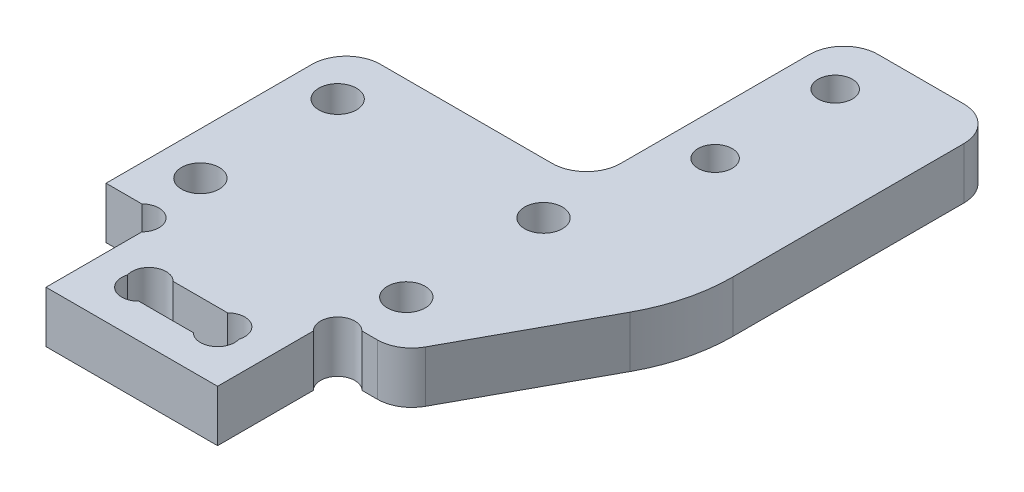
ISO-10303-21;
HEADER;
FILE_DESCRIPTION(('STEP AP214'),'2;1');
FILE_NAME('part.step','',(''),(''),'','','');
FILE_SCHEMA(('AUTOMOTIVE_DESIGN { 1 0 10303 214 1 1 1 1 }'));
ENDSEC;
DATA;
#1=APPLICATION_CONTEXT('core data for automotive mechanical design processes');
#2=APPLICATION_PROTOCOL_DEFINITION('international standard','automotive_design',2000,#1);
#3=PRODUCT_CONTEXT('',#1,'mechanical');
#4=PRODUCT('Part','Part','',(#3));
#5=PRODUCT_RELATED_PRODUCT_CATEGORY('part','',(#4));
#6=PRODUCT_DEFINITION_FORMATION('','',#4);
#7=PRODUCT_DEFINITION_CONTEXT('part definition',#1,'design');
#8=PRODUCT_DEFINITION('design','',#6,#7);
#9=PRODUCT_DEFINITION_SHAPE('','',#8);
#10=(LENGTH_UNIT() NAMED_UNIT(*) SI_UNIT(.MILLI.,.METRE.));
#11=(NAMED_UNIT(*) PLANE_ANGLE_UNIT() SI_UNIT($,.RADIAN.));
#12=(NAMED_UNIT(*) SI_UNIT($,.STERADIAN.) SOLID_ANGLE_UNIT());
#13=UNCERTAINTY_MEASURE_WITH_UNIT(LENGTH_MEASURE(1.E-05),#10,'distance_accuracy_value','');
#14=(GEOMETRIC_REPRESENTATION_CONTEXT(3) GLOBAL_UNCERTAINTY_ASSIGNED_CONTEXT((#13)) GLOBAL_UNIT_ASSIGNED_CONTEXT((#10,
#11,#12)) REPRESENTATION_CONTEXT('',''));
#15=CARTESIAN_POINT('',(0.,0.,0.));
#16=DIRECTION('',(0.,0.,1.));
#17=DIRECTION('',(1.,0.,0.));
#18=AXIS2_PLACEMENT_3D('',#15,#16,#17);
#19=CARTESIAN_POINT('',(-8.5,3.,7.));
#20=DIRECTION('',(0.,0.,-1.));
#21=DIRECTION('',(-1.,0.,0.));
#22=AXIS2_PLACEMENT_3D('',#19,#20,#21);
#23=PLANE('',#22);
#24=DIRECTION('',(1.,0.,0.));
#25=VECTOR('',#24,1.);
#26=CARTESIAN_POINT('',(-8.5,0.,7.));
#27=LINE('',#26,#25);
#28=CARTESIAN_POINT('',(6.4142135623731,0.,7.));
#29=VERTEX_POINT('',#28);
#30=CARTESIAN_POINT('',(7.3127338025197,0.,7.));
#31=VERTEX_POINT('',#30);
#32=EDGE_CURVE('E362',#29,#31,#27,.T.);
#33=ORIENTED_EDGE('',*,*,#32,.T.);
#34=DIRECTION('',(0.,-1.,0.));
#35=VECTOR('',#34,1.);
#36=CARTESIAN_POINT('',(7.3127338025197,3.,7.));
#37=LINE('',#36,#35);
#38=CARTESIAN_POINT('',(7.3127338025197,3.,7.));
#39=VERTEX_POINT('',#38);
#40=EDGE_CURVE('E421',#31,#39,#37,.F.);
#41=ORIENTED_EDGE('',*,*,#40,.T.);
#42=DIRECTION('',(1.,0.,0.));
#43=VECTOR('',#42,1.);
#44=CARTESIAN_POINT('',(-8.5,3.,7.));
#45=LINE('',#44,#43);
#46=CARTESIAN_POINT('',(6.4142135623731,3.,7.));
#47=VERTEX_POINT('',#46);
#48=EDGE_CURVE('E353',#47,#39,#45,.T.);
#49=ORIENTED_EDGE('',*,*,#48,.F.);
#50=DIRECTION('',(0.,1.,0.));
#51=VECTOR('',#50,1.);
#52=CARTESIAN_POINT('',(6.4142135623731,0.,7.));
#53=LINE('',#52,#51);
#54=EDGE_CURVE('E254',#47,#29,#53,.F.);
#55=ORIENTED_EDGE('',*,*,#54,.T.);
#56=EDGE_LOOP('',(#33,#41,#49,#55));
#57=FACE_BOUND('',#56,.T.);
#58=ADVANCED_FACE('F38',(#57),#23,.F.);
#59=CARTESIAN_POINT('',(-8.5,3.,-7.));
#60=DIRECTION('',(0.,0.,1.));
#61=DIRECTION('',(1.,0.,0.));
#62=AXIS2_PLACEMENT_3D('',#59,#60,#61);
#63=PLANE('',#62);
#64=DIRECTION('',(-1.,0.,0.));
#65=VECTOR('',#64,1.);
#66=CARTESIAN_POINT('',(-8.5,3.,-7.));
#67=LINE('',#66,#65);
#68=CARTESIAN_POINT('',(3.5,3.,-7.));
#69=VERTEX_POINT('',#68);
#70=CARTESIAN_POINT('',(-6.5,3.,-7.));
#71=VERTEX_POINT('',#70);
#72=EDGE_CURVE('E347',#69,#71,#67,.T.);
#73=ORIENTED_EDGE('',*,*,#72,.F.);
#74=DIRECTION('',(0.,1.,0.));
#75=VECTOR('',#74,1.);
#76=CARTESIAN_POINT('',(3.5,0.,-7.));
#77=LINE('',#76,#75);
#78=CARTESIAN_POINT('',(3.5,0.,-7.));
#79=VERTEX_POINT('',#78);
#80=EDGE_CURVE('E413',#69,#79,#77,.F.);
#81=ORIENTED_EDGE('',*,*,#80,.T.);
#82=DIRECTION('',(-1.,0.,0.));
#83=VECTOR('',#82,1.);
#84=CARTESIAN_POINT('',(-8.5,0.,-7.));
#85=LINE('',#84,#83);
#86=CARTESIAN_POINT('',(-6.5,0.,-7.));
#87=VERTEX_POINT('',#86);
#88=EDGE_CURVE('E344',#79,#87,#85,.T.);
#89=ORIENTED_EDGE('',*,*,#88,.T.);
#90=DIRECTION('',(0.,-1.,0.));
#91=VECTOR('',#90,1.);
#92=CARTESIAN_POINT('',(-6.5,3.,-7.));
#93=LINE('',#92,#91);
#94=EDGE_CURVE('E411',#87,#71,#93,.F.);
#95=ORIENTED_EDGE('',*,*,#94,.T.);
#96=EDGE_LOOP('',(#73,#81,#89,#95));
#97=FACE_BOUND('',#96,.T.);
#98=ADVANCED_FACE('F455',(#97),#63,.F.);
#99=CARTESIAN_POINT('',(0.,3.,0.));
#100=DIRECTION('',(0.,-1.,0.));
#101=DIRECTION('',(0.,0.,-1.));
#102=AXIS2_PLACEMENT_3D('',#99,#100,#101);
#103=PLANE('',#102);
#104=CARTESIAN_POINT('',(8.,3.,-19.));
#105=DIRECTION('',(0.,1.,0.));
#106=DIRECTION('',(0.,0.,1.));
#107=AXIS2_PLACEMENT_3D('',#104,#105,#106);
#108=CIRCLE('',#107,1.);
#109=CARTESIAN_POINT('',(8.,3.,-18.));
#110=VERTEX_POINT('',#109);
#111=EDGE_CURVE('E291',#110,#110,#108,.T.);
#112=ORIENTED_EDGE('',*,*,#111,.F.);
#113=EDGE_LOOP('',(#112));
#114=FACE_BOUND('',#113,.T.);
#115=CARTESIAN_POINT('',(8.,3.,-12.));
#116=DIRECTION('',(0.,1.,0.));
#117=DIRECTION('',(0.,0.,1.));
#118=AXIS2_PLACEMENT_3D('',#115,#116,#117);
#119=CIRCLE('',#118,1.);
#120=CARTESIAN_POINT('',(8.,3.,-11.));
#121=VERTEX_POINT('',#120);
#122=EDGE_CURVE('E282',#121,#121,#119,.T.);
#123=ORIENTED_EDGE('',*,*,#122,.F.);
#124=EDGE_LOOP('',(#123));
#125=FACE_BOUND('',#124,.T.);
#126=DIRECTION('',(0.,0.,-1.));
#127=VECTOR('',#126,1.);
#128=CARTESIAN_POINT('',(14.5,3.,0.));
#129=LINE('',#128,#127);
#130=CARTESIAN_POINT('',(14.5,3.,-6.54994014356944));
#131=VERTEX_POINT('',#130);
#132=CARTESIAN_POINT('',(14.5,3.,-20.));
#133=VERTEX_POINT('',#132);
#134=EDGE_CURVE('E307',#131,#133,#129,.T.);
#135=ORIENTED_EDGE('',*,*,#134,.T.);
#136=CARTESIAN_POINT('',(12.5,3.,-20.));
#137=DIRECTION('',(0.,-1.,0.));
#138=DIRECTION('',(0.,0.,-1.));
#139=AXIS2_PLACEMENT_3D('',#136,#137,#138);
#140=CIRCLE('',#139,2.);
#141=CARTESIAN_POINT('',(12.5,3.,-22.));
#142=VERTEX_POINT('',#141);
#143=EDGE_CURVE('E391',#133,#142,#140,.F.);
#144=ORIENTED_EDGE('',*,*,#143,.T.);
#145=DIRECTION('',(1.,0.,0.));
#146=VECTOR('',#145,1.);
#147=CARTESIAN_POINT('',(0.,3.,-22.));
#148=LINE('',#147,#146);
#149=CARTESIAN_POINT('',(7.5,3.,-22.));
#150=VERTEX_POINT('',#149);
#151=EDGE_CURVE('E303',#150,#142,#148,.T.);
#152=ORIENTED_EDGE('',*,*,#151,.F.);
#153=CARTESIAN_POINT('',(7.5,3.,-20.));
#154=DIRECTION('',(0.,-1.,0.));
#155=DIRECTION('',(0.,0.,-1.));
#156=AXIS2_PLACEMENT_3D('',#153,#154,#155);
#157=CIRCLE('',#156,2.);
#158=CARTESIAN_POINT('',(5.5,3.,-20.));
#159=VERTEX_POINT('',#158);
#160=EDGE_CURVE('E385',#150,#159,#157,.F.);
#161=ORIENTED_EDGE('',*,*,#160,.T.);
#162=DIRECTION('',(0.,0.,-1.));
#163=VECTOR('',#162,1.);
#164=CARTESIAN_POINT('',(5.5,3.,0.));
#165=LINE('',#164,#163);
#166=CARTESIAN_POINT('',(5.5,3.,-9.));
#167=VERTEX_POINT('',#166);
#168=EDGE_CURVE('E299',#167,#159,#165,.T.);
#169=ORIENTED_EDGE('',*,*,#168,.F.);
#170=CARTESIAN_POINT('',(3.5,3.,-9.));
#171=DIRECTION('',(0.,-1.,0.));
#172=DIRECTION('',(0.,0.,-1.));
#173=AXIS2_PLACEMENT_3D('',#170,#171,#172);
#174=CIRCLE('',#173,2.);
#175=EDGE_CURVE('E423',#167,#69,#174,.T.);
#176=ORIENTED_EDGE('',*,*,#175,.T.);
#177=ORIENTED_EDGE('',*,*,#72,.T.);
#178=CARTESIAN_POINT('',(-6.5,3.,-5.));
#179=DIRECTION('',(0.,-1.,0.));
#180=DIRECTION('',(0.,0.,-1.));
#181=AXIS2_PLACEMENT_3D('',#178,#179,#180);
#182=CIRCLE('',#181,2.);
#183=CARTESIAN_POINT('',(-8.5,3.,-5.));
#184=VERTEX_POINT('',#183);
#185=EDGE_CURVE('E389',#71,#184,#182,.F.);
#186=ORIENTED_EDGE('',*,*,#185,.T.);
#187=DIRECTION('',(0.,0.,1.));
#188=VECTOR('',#187,1.);
#189=CARTESIAN_POINT('',(-8.5,3.,7.));
#190=LINE('',#189,#188);
#191=CARTESIAN_POINT('',(-8.5,3.,7.));
#192=VERTEX_POINT('',#191);
#193=EDGE_CURVE('E350',#184,#192,#190,.T.);
#194=ORIENTED_EDGE('',*,*,#193,.T.);
#195=CARTESIAN_POINT('',(-6.4142135623731,3.,7.));
#196=VERTEX_POINT('',#195);
#197=EDGE_CURVE('E354',#192,#196,#45,.T.);
#198=ORIENTED_EDGE('',*,*,#197,.T.);
#199=CARTESIAN_POINT('',(-5.70710678118656,3.,7.70710678118655));
#200=DIRECTION('',(0.,1.,0.));
#201=DIRECTION('',(0.,0.,-1.));
#202=AXIS2_PLACEMENT_3D('',#199,#200,#201);
#203=CIRCLE('',#202,0.999999999999999);
#204=CARTESIAN_POINT('',(-5.,3.,8.41421356237309));
#205=VERTEX_POINT('',#204);
#206=EDGE_CURVE('E228',#205,#196,#203,.T.);
#207=ORIENTED_EDGE('',*,*,#206,.F.);
#208=DIRECTION('',(0.,0.,1.));
#209=VECTOR('',#208,1.);
#210=CARTESIAN_POINT('',(-5.,3.,0.));
#211=LINE('',#210,#209);
#212=CARTESIAN_POINT('',(-5.,3.,14.));
#213=VERTEX_POINT('',#212);
#214=EDGE_CURVE('E262',#205,#213,#211,.T.);
#215=ORIENTED_EDGE('',*,*,#214,.T.);
#216=DIRECTION('',(1.,0.,0.));
#217=VECTOR('',#216,1.);
#218=CARTESIAN_POINT('',(0.,3.,14.));
#219=LINE('',#218,#217);
#220=CARTESIAN_POINT('',(5.,3.,14.));
#221=VERTEX_POINT('',#220);
#222=EDGE_CURVE('E258',#213,#221,#219,.T.);
#223=ORIENTED_EDGE('',*,*,#222,.T.);
#224=DIRECTION('',(0.,0.,1.));
#225=VECTOR('',#224,1.);
#226=CARTESIAN_POINT('',(5.,3.,0.));
#227=LINE('',#226,#225);
#228=CARTESIAN_POINT('',(5.,3.,8.41421356237309));
#229=VERTEX_POINT('',#228);
#230=EDGE_CURVE('E257',#229,#221,#227,.T.);
#231=ORIENTED_EDGE('',*,*,#230,.F.);
#232=CARTESIAN_POINT('',(5.70710678118655,3.,7.70710678118654));
#233=DIRECTION('',(0.,1.,0.));
#234=DIRECTION('',(0.,0.,1.));
#235=AXIS2_PLACEMENT_3D('',#232,#233,#234);
#236=CIRCLE('',#235,1.);
#237=EDGE_CURVE('E246',#47,#229,#236,.T.);
#238=ORIENTED_EDGE('',*,*,#237,.F.);
#239=ORIENTED_EDGE('',*,*,#48,.T.);
#240=CARTESIAN_POINT('',(7.3127338025197,3.,5.));
#241=DIRECTION('',(0.,-1.,0.));
#242=DIRECTION('',(0.,0.,-1.));
#243=AXIS2_PLACEMENT_3D('',#240,#241,#242);
#244=CIRCLE('',#243,2.);
#245=CARTESIAN_POINT('',(9.06852494834847,3.,5.95770426136115));
#246=VERTEX_POINT('',#245);
#247=EDGE_CURVE('E387',#39,#246,#244,.F.);
#248=ORIENTED_EDGE('',*,*,#247,.T.);
#249=DIRECTION('',(-0.478852130680573,0.,0.877895572914384));
#250=VECTOR('',#249,1.);
#251=CARTESIAN_POINT('',(9.49363057324841,3.,5.17834394904459));
#252=LINE('',#251,#250);
#253=CARTESIAN_POINT('',(13.2789557291438,3.,-1.76141883676371));
#254=VERTEX_POINT('',#253);
#255=EDGE_CURVE('E302',#254,#246,#252,.T.);
#256=ORIENTED_EDGE('',*,*,#255,.F.);
#257=CARTESIAN_POINT('',(4.5,3.,-6.54994014356944));
#258=DIRECTION('',(0.,-1.,0.));
#259=DIRECTION('',(0.,0.,-1.));
#260=AXIS2_PLACEMENT_3D('',#257,#258,#259);
#261=CIRCLE('',#260,10.);
#262=EDGE_CURVE('E376',#254,#131,#261,.F.);
#263=ORIENTED_EDGE('',*,*,#262,.T.);
#264=EDGE_LOOP('',(#135,#144,#152,#161,#169,#176,#177,#186,#194,#198,#207,#215,#223,#231,#238,
#239,#248,#256,#263));
#265=FACE_BOUND('',#264,.T.);
#266=CARTESIAN_POINT('',(-6.,3.,-4.));
#267=DIRECTION('',(0.,1.,0.));
#268=DIRECTION('',(0.,0.,1.));
#269=AXIS2_PLACEMENT_3D('',#266,#267,#268);
#270=CIRCLE('',#269,1.1);
#271=CARTESIAN_POINT('',(-6.,3.,-2.9));
#272=VERTEX_POINT('',#271);
#273=EDGE_CURVE('E341',#272,#272,#270,.T.);
#274=ORIENTED_EDGE('',*,*,#273,.F.);
#275=EDGE_LOOP('',(#274));
#276=FACE_BOUND('',#275,.T.);
#277=CARTESIAN_POINT('',(6.,3.,-4.));
#278=DIRECTION('',(0.,1.,0.));
#279=DIRECTION('',(0.,0.,-1.));
#280=AXIS2_PLACEMENT_3D('',#277,#278,#279);
#281=CIRCLE('',#280,1.1);
#282=CARTESIAN_POINT('',(6.,3.,-5.1));
#283=VERTEX_POINT('',#282);
#284=EDGE_CURVE('E335',#283,#283,#281,.T.);
#285=ORIENTED_EDGE('',*,*,#284,.F.);
#286=EDGE_LOOP('',(#285));
#287=FACE_BOUND('',#286,.T.);
#288=CARTESIAN_POINT('',(6.,3.,4.));
#289=DIRECTION('',(0.,1.,0.));
#290=DIRECTION('',(0.,0.,1.));
#291=AXIS2_PLACEMENT_3D('',#288,#289,#290);
#292=CIRCLE('',#291,1.1);
#293=CARTESIAN_POINT('',(6.,3.,5.1));
#294=VERTEX_POINT('',#293);
#295=EDGE_CURVE('E329',#294,#294,#292,.T.);
#296=ORIENTED_EDGE('',*,*,#295,.F.);
#297=EDGE_LOOP('',(#296));
#298=FACE_BOUND('',#297,.T.);
#299=CARTESIAN_POINT('',(-6.,3.,4.));
#300=DIRECTION('',(0.,1.,0.));
#301=DIRECTION('',(0.,0.,-1.));
#302=AXIS2_PLACEMENT_3D('',#299,#300,#301);
#303=CIRCLE('',#302,1.1);
#304=CARTESIAN_POINT('',(-6.,3.,2.9));
#305=VERTEX_POINT('',#304);
#306=EDGE_CURVE('E323',#305,#305,#303,.T.);
#307=ORIENTED_EDGE('',*,*,#306,.F.);
#308=EDGE_LOOP('',(#307));
#309=FACE_BOUND('',#308,.T.);
#310=DIRECTION('',(1.,0.,0.));
#311=VECTOR('',#310,1.);
#312=CARTESIAN_POINT('',(0.,3.,12.));
#313=LINE('',#312,#311);
#314=CARTESIAN_POINT('',(-1.5857864376269,3.,12.));
#315=VERTEX_POINT('',#314);
#316=CARTESIAN_POINT('',(1.5857864376269,3.,12.));
#317=VERTEX_POINT('',#316);
#318=EDGE_CURVE('E269',#315,#317,#313,.T.);
#319=ORIENTED_EDGE('',*,*,#318,.F.);
#320=CARTESIAN_POINT('',(-2.29289321881345,3.,11.2928932188135));
#321=DIRECTION('',(0.,1.,0.));
#322=DIRECTION('',(0.,0.,-1.));
#323=AXIS2_PLACEMENT_3D('',#320,#321,#322);
#324=CIRCLE('',#323,1.);
#325=CARTESIAN_POINT('',(-3.24903837639838,3.,11.));
#326=VERTEX_POINT('',#325);
#327=EDGE_CURVE('E53',#326,#315,#324,.T.);
#328=ORIENTED_EDGE('',*,*,#327,.F.);
#329=CARTESIAN_POINT('',(-2.29289321881345,3.,10.7071067811865));
#330=DIRECTION('',(0.,1.,0.));
#331=DIRECTION('',(0.,0.,1.));
#332=AXIS2_PLACEMENT_3D('',#329,#330,#331);
#333=CIRCLE('',#332,1.);
#334=CARTESIAN_POINT('',(-1.5857864376269,3.,10.));
#335=VERTEX_POINT('',#334);
#336=EDGE_CURVE('E222',#335,#326,#333,.T.);
#337=ORIENTED_EDGE('',*,*,#336,.F.);
#338=DIRECTION('',(1.,0.,0.));
#339=VECTOR('',#338,1.);
#340=CARTESIAN_POINT('',(0.,3.,10.));
#341=LINE('',#340,#339);
#342=CARTESIAN_POINT('',(1.5857864376269,3.,10.));
#343=VERTEX_POINT('',#342);
#344=EDGE_CURVE('E264',#335,#343,#341,.T.);
#345=ORIENTED_EDGE('',*,*,#344,.T.);
#346=CARTESIAN_POINT('',(2.29289321881345,3.,10.7071067811865));
#347=DIRECTION('',(0.,1.,0.));
#348=DIRECTION('',(0.,0.,-1.));
#349=AXIS2_PLACEMENT_3D('',#346,#347,#348);
#350=CIRCLE('',#349,1.);
#351=CARTESIAN_POINT('',(3.24903837639838,3.,11.));
#352=VERTEX_POINT('',#351);
#353=EDGE_CURVE('E238',#352,#343,#350,.T.);
#354=ORIENTED_EDGE('',*,*,#353,.F.);
#355=CARTESIAN_POINT('',(2.29289321881345,3.,11.2928932188135));
#356=DIRECTION('',(0.,1.,0.));
#357=DIRECTION('',(0.,0.,1.));
#358=AXIS2_PLACEMENT_3D('',#355,#356,#357);
#359=CIRCLE('',#358,1.);
#360=EDGE_CURVE('E235',#317,#352,#359,.T.);
#361=ORIENTED_EDGE('',*,*,#360,.F.);
#362=EDGE_LOOP('',(#319,#328,#337,#345,#354,#361));
#363=FACE_BOUND('',#362,.T.);
#364=ADVANCED_FACE('F432',(#114,#125,#265,#276,#287,#298,#309,#363),#103,.F.);
#365=CARTESIAN_POINT('',(0.,0.,0.));
#366=DIRECTION('',(0.,-1.,0.));
#367=DIRECTION('',(0.,0.,-1.));
#368=AXIS2_PLACEMENT_3D('',#365,#366,#367);
#369=PLANE('',#368);
#370=CARTESIAN_POINT('',(-2.29289321881345,0.,11.2928932188135));
#371=DIRECTION('',(0.,1.,0.));
#372=DIRECTION('',(0.,0.,-1.));
#373=AXIS2_PLACEMENT_3D('',#370,#371,#372);
#374=CIRCLE('',#373,1.);
#375=CARTESIAN_POINT('',(-3.24903837639838,0.,11.));
#376=VERTEX_POINT('',#375);
#377=CARTESIAN_POINT('',(-1.5857864376269,0.,12.));
#378=VERTEX_POINT('',#377);
#379=EDGE_CURVE('E212',#376,#378,#374,.T.);
#380=ORIENTED_EDGE('',*,*,#379,.T.);
#381=DIRECTION('',(1.,0.,0.));
#382=VECTOR('',#381,1.);
#383=CARTESIAN_POINT('',(0.,0.,12.));
#384=LINE('',#383,#382);
#385=CARTESIAN_POINT('',(1.5857864376269,0.,12.));
#386=VERTEX_POINT('',#385);
#387=EDGE_CURVE('E280',#378,#386,#384,.T.);
#388=ORIENTED_EDGE('',*,*,#387,.T.);
#389=CARTESIAN_POINT('',(2.29289321881345,0.,11.2928932188135));
#390=DIRECTION('',(0.,1.,0.));
#391=DIRECTION('',(0.,0.,1.));
#392=AXIS2_PLACEMENT_3D('',#389,#390,#391);
#393=CIRCLE('',#392,1.);
#394=CARTESIAN_POINT('',(3.24903837639838,0.,11.));
#395=VERTEX_POINT('',#394);
#396=EDGE_CURVE('E61',#386,#395,#393,.T.);
#397=ORIENTED_EDGE('',*,*,#396,.T.);
#398=CARTESIAN_POINT('',(2.29289321881345,0.,10.7071067811865));
#399=DIRECTION('',(0.,1.,0.));
#400=DIRECTION('',(0.,0.,-1.));
#401=AXIS2_PLACEMENT_3D('',#398,#399,#400);
#402=CIRCLE('',#401,1.);
#403=CARTESIAN_POINT('',(1.5857864376269,0.,10.));
#404=VERTEX_POINT('',#403);
#405=EDGE_CURVE('E233',#395,#404,#402,.T.);
#406=ORIENTED_EDGE('',*,*,#405,.T.);
#407=DIRECTION('',(1.,0.,0.));
#408=VECTOR('',#407,1.);
#409=CARTESIAN_POINT('',(0.,0.,10.));
#410=LINE('',#409,#408);
#411=CARTESIAN_POINT('',(-1.5857864376269,0.,10.));
#412=VERTEX_POINT('',#411);
#413=EDGE_CURVE('E215',#412,#404,#410,.T.);
#414=ORIENTED_EDGE('',*,*,#413,.F.);
#415=CARTESIAN_POINT('',(-2.29289321881345,0.,10.7071067811865));
#416=DIRECTION('',(0.,1.,0.));
#417=DIRECTION('',(0.,0.,1.));
#418=AXIS2_PLACEMENT_3D('',#415,#416,#417);
#419=CIRCLE('',#418,1.);
#420=EDGE_CURVE('E207',#412,#376,#419,.T.);
#421=ORIENTED_EDGE('',*,*,#420,.T.);
#422=EDGE_LOOP('',(#380,#388,#397,#406,#414,#421));
#423=FACE_BOUND('',#422,.T.);
#424=DIRECTION('',(1.,0.,0.));
#425=VECTOR('',#424,1.);
#426=CARTESIAN_POINT('',(0.,0.,-22.));
#427=LINE('',#426,#425);
#428=CARTESIAN_POINT('',(7.5,0.,-22.));
#429=VERTEX_POINT('',#428);
#430=CARTESIAN_POINT('',(12.5,0.,-22.));
#431=VERTEX_POINT('',#430);
#432=EDGE_CURVE('E310',#429,#431,#427,.T.);
#433=ORIENTED_EDGE('',*,*,#432,.T.);
#434=CARTESIAN_POINT('',(12.5,0.,-20.));
#435=DIRECTION('',(0.,-1.,0.));
#436=DIRECTION('',(0.,0.,-1.));
#437=AXIS2_PLACEMENT_3D('',#434,#435,#436);
#438=CIRCLE('',#437,2.);
#439=CARTESIAN_POINT('',(14.5,0.,-20.));
#440=VERTEX_POINT('',#439);
#441=EDGE_CURVE('E404',#431,#440,#438,.T.);
#442=ORIENTED_EDGE('',*,*,#441,.T.);
#443=DIRECTION('',(0.,0.,-1.));
#444=VECTOR('',#443,1.);
#445=CARTESIAN_POINT('',(14.5,0.,0.));
#446=LINE('',#445,#444);
#447=CARTESIAN_POINT('',(14.5,0.,-6.54994014356944));
#448=VERTEX_POINT('',#447);
#449=EDGE_CURVE('E306',#448,#440,#446,.T.);
#450=ORIENTED_EDGE('',*,*,#449,.F.);
#451=CARTESIAN_POINT('',(4.5,0.,-6.54994014356944));
#452=DIRECTION('',(0.,-1.,0.));
#453=DIRECTION('',(0.,0.,-1.));
#454=AXIS2_PLACEMENT_3D('',#451,#452,#453);
#455=CIRCLE('',#454,10.);
#456=CARTESIAN_POINT('',(13.2789557291438,0.,-1.76141883676371));
#457=VERTEX_POINT('',#456);
#458=EDGE_CURVE('E380',#448,#457,#455,.T.);
#459=ORIENTED_EDGE('',*,*,#458,.T.);
#460=DIRECTION('',(-0.478852130680573,0.,0.877895572914385));
#461=VECTOR('',#460,1.);
#462=CARTESIAN_POINT('',(9.49363057324841,0.,5.17834394904459));
#463=LINE('',#462,#461);
#464=CARTESIAN_POINT('',(9.06852494834847,0.,5.95770426136115));
#465=VERTEX_POINT('',#464);
#466=EDGE_CURVE('E290',#457,#465,#463,.T.);
#467=ORIENTED_EDGE('',*,*,#466,.T.);
#468=CARTESIAN_POINT('',(7.3127338025197,0.,5.));
#469=DIRECTION('',(0.,-1.,0.));
#470=DIRECTION('',(0.,0.,-1.));
#471=AXIS2_PLACEMENT_3D('',#468,#469,#470);
#472=CIRCLE('',#471,2.);
#473=EDGE_CURVE('E400',#465,#31,#472,.T.);
#474=ORIENTED_EDGE('',*,*,#473,.T.);
#475=ORIENTED_EDGE('',*,*,#32,.F.);
#476=CARTESIAN_POINT('',(5.70710678118655,0.,7.70710678118654));
#477=DIRECTION('',(0.,1.,0.));
#478=DIRECTION('',(0.,0.,1.));
#479=AXIS2_PLACEMENT_3D('',#476,#477,#478);
#480=CIRCLE('',#479,1.);
#481=CARTESIAN_POINT('',(5.,0.,8.41421356237309));
#482=VERTEX_POINT('',#481);
#483=EDGE_CURVE('E243',#29,#482,#480,.T.);
#484=ORIENTED_EDGE('',*,*,#483,.T.);
#485=DIRECTION('',(0.,0.,1.));
#486=VECTOR('',#485,1.);
#487=CARTESIAN_POINT('',(5.,0.,0.));
#488=LINE('',#487,#486);
#489=CARTESIAN_POINT('',(5.,0.,14.));
#490=VERTEX_POINT('',#489);
#491=EDGE_CURVE('E261',#482,#490,#488,.T.);
#492=ORIENTED_EDGE('',*,*,#491,.T.);
#493=DIRECTION('',(1.,0.,0.));
#494=VECTOR('',#493,1.);
#495=CARTESIAN_POINT('',(0.,0.,14.));
#496=LINE('',#495,#494);
#497=CARTESIAN_POINT('',(-5.,0.,14.));
#498=VERTEX_POINT('',#497);
#499=EDGE_CURVE('E266',#498,#490,#496,.T.);
#500=ORIENTED_EDGE('',*,*,#499,.F.);
#501=DIRECTION('',(0.,0.,1.));
#502=VECTOR('',#501,1.);
#503=CARTESIAN_POINT('',(-5.,0.,0.));
#504=LINE('',#503,#502);
#505=CARTESIAN_POINT('',(-5.,0.,8.41421356237309));
#506=VERTEX_POINT('',#505);
#507=EDGE_CURVE('E274',#506,#498,#504,.T.);
#508=ORIENTED_EDGE('',*,*,#507,.F.);
#509=CARTESIAN_POINT('',(-5.70710678118656,0.,7.70710678118655));
#510=DIRECTION('',(0.,1.,0.));
#511=DIRECTION('',(0.,0.,-1.));
#512=AXIS2_PLACEMENT_3D('',#509,#510,#511);
#513=CIRCLE('',#512,0.999999999999999);
#514=CARTESIAN_POINT('',(-6.4142135623731,0.,7.));
#515=VERTEX_POINT('',#514);
#516=EDGE_CURVE('E248',#506,#515,#513,.T.);
#517=ORIENTED_EDGE('',*,*,#516,.T.);
#518=CARTESIAN_POINT('',(-8.5,0.,7.));
#519=VERTEX_POINT('',#518);
#520=EDGE_CURVE('E351',#519,#515,#27,.T.);
#521=ORIENTED_EDGE('',*,*,#520,.F.);
#522=DIRECTION('',(0.,0.,1.));
#523=VECTOR('',#522,1.);
#524=CARTESIAN_POINT('',(-8.5,0.,7.));
#525=LINE('',#524,#523);
#526=CARTESIAN_POINT('',(-8.5,0.,-5.));
#527=VERTEX_POINT('',#526);
#528=EDGE_CURVE('E360',#527,#519,#525,.T.);
#529=ORIENTED_EDGE('',*,*,#528,.F.);
#530=CARTESIAN_POINT('',(-6.5,0.,-5.));
#531=DIRECTION('',(0.,-1.,0.));
#532=DIRECTION('',(0.,0.,-1.));
#533=AXIS2_PLACEMENT_3D('',#530,#531,#532);
#534=CIRCLE('',#533,2.);
#535=EDGE_CURVE('E402',#527,#87,#534,.T.);
#536=ORIENTED_EDGE('',*,*,#535,.T.);
#537=ORIENTED_EDGE('',*,*,#88,.F.);
#538=CARTESIAN_POINT('',(3.5,0.,-9.));
#539=DIRECTION('',(0.,-1.,0.));
#540=DIRECTION('',(0.,0.,-1.));
#541=AXIS2_PLACEMENT_3D('',#538,#539,#540);
#542=CIRCLE('',#541,2.);
#543=CARTESIAN_POINT('',(5.5,0.,-9.));
#544=VERTEX_POINT('',#543);
#545=EDGE_CURVE('E425',#79,#544,#542,.F.);
#546=ORIENTED_EDGE('',*,*,#545,.T.);
#547=DIRECTION('',(0.,0.,-1.));
#548=VECTOR('',#547,1.);
#549=CARTESIAN_POINT('',(5.5,0.,0.));
#550=LINE('',#549,#548);
#551=CARTESIAN_POINT('',(5.5,0.,-20.));
#552=VERTEX_POINT('',#551);
#553=EDGE_CURVE('E318',#544,#552,#550,.T.);
#554=ORIENTED_EDGE('',*,*,#553,.T.);
#555=CARTESIAN_POINT('',(7.5,0.,-20.));
#556=DIRECTION('',(0.,-1.,0.));
#557=DIRECTION('',(0.,0.,-1.));
#558=AXIS2_PLACEMENT_3D('',#555,#556,#557);
#559=CIRCLE('',#558,2.);
#560=EDGE_CURVE('E398',#552,#429,#559,.T.);
#561=ORIENTED_EDGE('',*,*,#560,.T.);
#562=EDGE_LOOP('',(#433,#442,#450,#459,#467,#474,#475,#484,#492,#500,#508,#517,#521,#529,#536,
#537,#546,#554,#561));
#563=FACE_BOUND('',#562,.T.);
#564=CARTESIAN_POINT('',(8.,0.,-19.));
#565=DIRECTION('',(0.,1.,0.));
#566=DIRECTION('',(0.,0.,1.));
#567=AXIS2_PLACEMENT_3D('',#564,#565,#566);
#568=CIRCLE('',#567,1.);
#569=CARTESIAN_POINT('',(8.,0.,-18.));
#570=VERTEX_POINT('',#569);
#571=EDGE_CURVE('E287',#570,#570,#568,.T.);
#572=ORIENTED_EDGE('',*,*,#571,.T.);
#573=EDGE_LOOP('',(#572));
#574=FACE_BOUND('',#573,.T.);
#575=CARTESIAN_POINT('',(8.,0.,-12.));
#576=DIRECTION('',(0.,1.,0.));
#577=DIRECTION('',(0.,0.,1.));
#578=AXIS2_PLACEMENT_3D('',#575,#576,#577);
#579=CIRCLE('',#578,1.);
#580=CARTESIAN_POINT('',(8.,0.,-11.));
#581=VERTEX_POINT('',#580);
#582=EDGE_CURVE('E294',#581,#581,#579,.T.);
#583=ORIENTED_EDGE('',*,*,#582,.T.);
#584=EDGE_LOOP('',(#583));
#585=FACE_BOUND('',#584,.T.);
#586=CARTESIAN_POINT('',(6.,0.,4.));
#587=DIRECTION('',(0.,1.,0.));
#588=DIRECTION('',(0.,0.,1.));
#589=AXIS2_PLACEMENT_3D('',#586,#587,#588);
#590=CIRCLE('',#589,1.1);
#591=CARTESIAN_POINT('',(6.,0.,5.1));
#592=VERTEX_POINT('',#591);
#593=EDGE_CURVE('E326',#592,#592,#590,.T.);
#594=ORIENTED_EDGE('',*,*,#593,.T.);
#595=EDGE_LOOP('',(#594));
#596=FACE_BOUND('',#595,.T.);
#597=CARTESIAN_POINT('',(-6.,0.,-4.));
#598=DIRECTION('',(0.,1.,0.));
#599=DIRECTION('',(0.,0.,1.));
#600=AXIS2_PLACEMENT_3D('',#597,#598,#599);
#601=CIRCLE('',#600,1.1);
#602=CARTESIAN_POINT('',(-6.,0.,-2.9));
#603=VERTEX_POINT('',#602);
#604=EDGE_CURVE('E338',#603,#603,#601,.T.);
#605=ORIENTED_EDGE('',*,*,#604,.T.);
#606=EDGE_LOOP('',(#605));
#607=FACE_BOUND('',#606,.T.);
#608=CARTESIAN_POINT('',(6.,0.,-4.));
#609=DIRECTION('',(0.,1.,0.));
#610=DIRECTION('',(0.,0.,-1.));
#611=AXIS2_PLACEMENT_3D('',#608,#609,#610);
#612=CIRCLE('',#611,1.1);
#613=CARTESIAN_POINT('',(6.,0.,-5.1));
#614=VERTEX_POINT('',#613);
#615=EDGE_CURVE('E332',#614,#614,#612,.T.);
#616=ORIENTED_EDGE('',*,*,#615,.T.);
#617=EDGE_LOOP('',(#616));
#618=FACE_BOUND('',#617,.T.);
#619=CARTESIAN_POINT('',(-6.,0.,4.));
#620=DIRECTION('',(0.,1.,0.));
#621=DIRECTION('',(0.,0.,-1.));
#622=AXIS2_PLACEMENT_3D('',#619,#620,#621);
#623=CIRCLE('',#622,1.1);
#624=CARTESIAN_POINT('',(-6.,0.,2.9));
#625=VERTEX_POINT('',#624);
#626=EDGE_CURVE('E313',#625,#625,#623,.T.);
#627=ORIENTED_EDGE('',*,*,#626,.T.);
#628=EDGE_LOOP('',(#627));
#629=FACE_BOUND('',#628,.T.);
#630=ADVANCED_FACE('F209',(#423,#563,#574,#585,#596,#607,#618,#629),#369,.T.);
#631=CARTESIAN_POINT('',(-8.5,3.,7.));
#632=DIRECTION('',(1.,0.,0.));
#633=DIRECTION('',(0.,0.,-1.));
#634=AXIS2_PLACEMENT_3D('',#631,#632,#633);
#635=PLANE('',#634);
#636=ORIENTED_EDGE('',*,*,#193,.F.);
#637=DIRECTION('',(0.,-1.,0.));
#638=VECTOR('',#637,1.);
#639=CARTESIAN_POINT('',(-8.5,3.,-5.));
#640=LINE('',#639,#638);
#641=EDGE_CURVE('E415',#184,#527,#640,.T.);
#642=ORIENTED_EDGE('',*,*,#641,.T.);
#643=ORIENTED_EDGE('',*,*,#528,.T.);
#644=DIRECTION('',(0.,-1.,0.));
#645=VECTOR('',#644,1.);
#646=CARTESIAN_POINT('',(-8.5,3.,7.));
#647=LINE('',#646,#645);
#648=EDGE_CURVE('E357',#192,#519,#647,.T.);
#649=ORIENTED_EDGE('',*,*,#648,.F.);
#650=EDGE_LOOP('',(#636,#642,#643,#649));
#651=FACE_BOUND('',#650,.T.);
#652=ADVANCED_FACE('F469',(#651),#635,.F.);
#653=ORIENTED_EDGE('',*,*,#520,.T.);
#654=DIRECTION('',(0.,1.,0.));
#655=VECTOR('',#654,1.);
#656=CARTESIAN_POINT('',(-6.4142135623731,0.,7.));
#657=LINE('',#656,#655);
#658=EDGE_CURVE('E245',#515,#196,#657,.T.);
#659=ORIENTED_EDGE('',*,*,#658,.T.);
#660=ORIENTED_EDGE('',*,*,#197,.F.);
#661=ORIENTED_EDGE('',*,*,#648,.T.);
#662=EDGE_LOOP('',(#653,#659,#660,#661));
#663=FACE_BOUND('',#662,.T.);
#664=ADVANCED_FACE('F458',(#663),#23,.F.);
#665=CARTESIAN_POINT('',(-6.,3.,-4.));
#666=DIRECTION('',(0.,-1.,0.));
#667=DIRECTION('',(0.,0.,-1.));
#668=AXIS2_PLACEMENT_3D('',#665,#666,#667);
#669=CYLINDRICAL_SURFACE('',#668,1.1);
#670=ORIENTED_EDGE('',*,*,#273,.T.);
#671=EDGE_LOOP('',(#670));
#672=FACE_BOUND('',#671,.T.);
#673=ORIENTED_EDGE('',*,*,#604,.F.);
#674=EDGE_LOOP('',(#673));
#675=FACE_BOUND('',#674,.T.);
#676=ADVANCED_FACE('F468',(#672,#675),#669,.F.);
#677=CARTESIAN_POINT('',(6.,3.,-4.));
#678=DIRECTION('',(0.,-1.,0.));
#679=DIRECTION('',(0.,0.,-1.));
#680=AXIS2_PLACEMENT_3D('',#677,#678,#679);
#681=CYLINDRICAL_SURFACE('',#680,1.1);
#682=ORIENTED_EDGE('',*,*,#284,.T.);
#683=EDGE_LOOP('',(#682));
#684=FACE_BOUND('',#683,.T.);
#685=ORIENTED_EDGE('',*,*,#615,.F.);
#686=EDGE_LOOP('',(#685));
#687=FACE_BOUND('',#686,.T.);
#688=ADVANCED_FACE('F475',(#684,#687),#681,.F.);
#689=CARTESIAN_POINT('',(6.,3.,4.));
#690=DIRECTION('',(0.,-1.,0.));
#691=DIRECTION('',(0.,0.,-1.));
#692=AXIS2_PLACEMENT_3D('',#689,#690,#691);
#693=CYLINDRICAL_SURFACE('',#692,1.1);
#694=ORIENTED_EDGE('',*,*,#295,.T.);
#695=EDGE_LOOP('',(#694));
#696=FACE_BOUND('',#695,.T.);
#697=ORIENTED_EDGE('',*,*,#593,.F.);
#698=EDGE_LOOP('',(#697));
#699=FACE_BOUND('',#698,.T.);
#700=ADVANCED_FACE('F580',(#696,#699),#693,.F.);
#701=CARTESIAN_POINT('',(-6.,3.,4.));
#702=DIRECTION('',(0.,-1.,0.));
#703=DIRECTION('',(0.,0.,-1.));
#704=AXIS2_PLACEMENT_3D('',#701,#702,#703);
#705=CYLINDRICAL_SURFACE('',#704,1.1);
#706=ORIENTED_EDGE('',*,*,#306,.T.);
#707=EDGE_LOOP('',(#706));
#708=FACE_BOUND('',#707,.T.);
#709=ORIENTED_EDGE('',*,*,#626,.F.);
#710=EDGE_LOOP('',(#709));
#711=FACE_BOUND('',#710,.T.);
#712=ADVANCED_FACE('F577',(#708,#711),#705,.F.);
#713=CARTESIAN_POINT('',(14.5,-30.3644529013779,0.));
#714=DIRECTION('',(1.,0.,0.));
#715=DIRECTION('',(0.,0.,-1.));
#716=AXIS2_PLACEMENT_3D('',#713,#714,#715);
#717=PLANE('',#716);
#718=ORIENTED_EDGE('',*,*,#449,.T.);
#719=DIRECTION('',(0.,1.,0.));
#720=VECTOR('',#719,1.);
#721=CARTESIAN_POINT('',(14.5,3.,-20.));
#722=LINE('',#721,#720);
#723=EDGE_CURVE('E382',#440,#133,#722,.T.);
#724=ORIENTED_EDGE('',*,*,#723,.T.);
#725=ORIENTED_EDGE('',*,*,#134,.F.);
#726=DIRECTION('',(0.,1.,0.));
#727=VECTOR('',#726,1.);
#728=CARTESIAN_POINT('',(14.5,0.,-6.54994014356944));
#729=LINE('',#728,#727);
#730=EDGE_CURVE('E378',#131,#448,#729,.F.);
#731=ORIENTED_EDGE('',*,*,#730,.T.);
#732=EDGE_LOOP('',(#718,#724,#725,#731));
#733=FACE_BOUND('',#732,.T.);
#734=ADVANCED_FACE('F527',(#733),#717,.T.);
#735=CARTESIAN_POINT('',(0.,-30.3644529013779,-22.));
#736=DIRECTION('',(0.,0.,1.));
#737=DIRECTION('',(1.,0.,0.));
#738=AXIS2_PLACEMENT_3D('',#735,#736,#737);
#739=PLANE('',#738);
#740=ORIENTED_EDGE('',*,*,#151,.T.);
#741=DIRECTION('',(0.,1.,0.));
#742=VECTOR('',#741,1.);
#743=CARTESIAN_POINT('',(12.5,0.,-22.));
#744=LINE('',#743,#742);
#745=EDGE_CURVE('E396',#142,#431,#744,.F.);
#746=ORIENTED_EDGE('',*,*,#745,.T.);
#747=ORIENTED_EDGE('',*,*,#432,.F.);
#748=DIRECTION('',(0.,1.,0.));
#749=VECTOR('',#748,1.);
#750=CARTESIAN_POINT('',(7.5,-30.3644529013779,-22.));
#751=LINE('',#750,#749);
#752=EDGE_CURVE('E393',#429,#150,#751,.T.);
#753=ORIENTED_EDGE('',*,*,#752,.T.);
#754=EDGE_LOOP('',(#740,#746,#747,#753));
#755=FACE_BOUND('',#754,.T.);
#756=ADVANCED_FACE('F518',(#755),#739,.F.);
#757=CARTESIAN_POINT('',(5.5,-30.3644529013779,0.));
#758=DIRECTION('',(1.,0.,0.));
#759=DIRECTION('',(0.,0.,-1.));
#760=AXIS2_PLACEMENT_3D('',#757,#758,#759);
#761=PLANE('',#760);
#762=ORIENTED_EDGE('',*,*,#553,.F.);
#763=DIRECTION('',(0.,1.,0.));
#764=VECTOR('',#763,1.);
#765=CARTESIAN_POINT('',(5.5,3.,-9.));
#766=LINE('',#765,#764);
#767=EDGE_CURVE('E408',#544,#167,#766,.T.);
#768=ORIENTED_EDGE('',*,*,#767,.T.);
#769=ORIENTED_EDGE('',*,*,#168,.T.);
#770=DIRECTION('',(0.,1.,0.));
#771=VECTOR('',#770,1.);
#772=CARTESIAN_POINT('',(5.5,-30.3644529013779,-20.));
#773=LINE('',#772,#771);
#774=EDGE_CURVE('E406',#159,#552,#773,.F.);
#775=ORIENTED_EDGE('',*,*,#774,.T.);
#776=EDGE_LOOP('',(#762,#768,#769,#775));
#777=FACE_BOUND('',#776,.T.);
#778=ADVANCED_FACE('F510',(#777),#761,.F.);
#779=CARTESIAN_POINT('',(9.49363057324841,-30.3644529013779,5.17834394904459));
#780=DIRECTION('',(-0.877895572914384,0.,-0.478852130680573));
#781=DIRECTION('',(-0.478852130680573,0.,0.877895572914385));
#782=AXIS2_PLACEMENT_3D('',#779,#780,#781);
#783=PLANE('',#782);
#784=ORIENTED_EDGE('',*,*,#255,.T.);
#785=DIRECTION('',(0.,-1.,0.));
#786=VECTOR('',#785,1.);
#787=CARTESIAN_POINT('',(9.06852494834847,-30.3644529013779,5.95770426136115));
#788=LINE('',#787,#786);
#789=EDGE_CURVE('E418',#246,#465,#788,.T.);
#790=ORIENTED_EDGE('',*,*,#789,.T.);
#791=ORIENTED_EDGE('',*,*,#466,.F.);
#792=DIRECTION('',(0.,1.,0.));
#793=VECTOR('',#792,1.);
#794=CARTESIAN_POINT('',(13.2789557291438,3.,-1.76141883676371));
#795=LINE('',#794,#793);
#796=EDGE_CURVE('E373',#457,#254,#795,.T.);
#797=ORIENTED_EDGE('',*,*,#796,.T.);
#798=EDGE_LOOP('',(#784,#790,#791,#797));
#799=FACE_BOUND('',#798,.T.);
#800=ADVANCED_FACE('F535',(#799),#783,.F.);
#801=CARTESIAN_POINT('',(8.,0.,-12.));
#802=DIRECTION('',(0.,1.,0.));
#803=DIRECTION('',(0.,0.,1.));
#804=AXIS2_PLACEMENT_3D('',#801,#802,#803);
#805=CYLINDRICAL_SURFACE('',#804,1.);
#806=ORIENTED_EDGE('',*,*,#582,.F.);
#807=EDGE_LOOP('',(#806));
#808=FACE_BOUND('',#807,.T.);
#809=ORIENTED_EDGE('',*,*,#122,.T.);
#810=EDGE_LOOP('',(#809));
#811=FACE_BOUND('',#810,.T.);
#812=ADVANCED_FACE('F564',(#808,#811),#805,.F.);
#813=CARTESIAN_POINT('',(8.,0.,-19.));
#814=DIRECTION('',(0.,1.,0.));
#815=DIRECTION('',(0.,0.,1.));
#816=AXIS2_PLACEMENT_3D('',#813,#814,#815);
#817=CYLINDRICAL_SURFACE('',#816,1.);
#818=ORIENTED_EDGE('',*,*,#571,.F.);
#819=EDGE_LOOP('',(#818));
#820=FACE_BOUND('',#819,.T.);
#821=ORIENTED_EDGE('',*,*,#111,.T.);
#822=EDGE_LOOP('',(#821));
#823=FACE_BOUND('',#822,.T.);
#824=ADVANCED_FACE('F559',(#820,#823),#817,.F.);
#825=CARTESIAN_POINT('',(5.,-12.2065556157337,0.));
#826=DIRECTION('',(-1.,0.,0.));
#827=DIRECTION('',(0.,0.,1.));
#828=AXIS2_PLACEMENT_3D('',#825,#826,#827);
#829=PLANE('',#828);
#830=ORIENTED_EDGE('',*,*,#491,.F.);
#831=DIRECTION('',(0.,1.,0.));
#832=VECTOR('',#831,1.);
#833=CARTESIAN_POINT('',(5.,0.,8.41421356237309));
#834=LINE('',#833,#832);
#835=EDGE_CURVE('E370',#482,#229,#834,.T.);
#836=ORIENTED_EDGE('',*,*,#835,.T.);
#837=ORIENTED_EDGE('',*,*,#230,.T.);
#838=DIRECTION('',(0.,1.,0.));
#839=VECTOR('',#838,1.);
#840=CARTESIAN_POINT('',(5.,-12.2065556157337,14.));
#841=LINE('',#840,#839);
#842=EDGE_CURVE('E276',#490,#221,#841,.T.);
#843=ORIENTED_EDGE('',*,*,#842,.F.);
#844=EDGE_LOOP('',(#830,#836,#837,#843));
#845=FACE_BOUND('',#844,.T.);
#846=ADVANCED_FACE('F552',(#845),#829,.F.);
#847=CARTESIAN_POINT('',(0.,-12.2065556157337,14.));
#848=DIRECTION('',(0.,0.,1.));
#849=DIRECTION('',(1.,0.,0.));
#850=AXIS2_PLACEMENT_3D('',#847,#848,#849);
#851=PLANE('',#850);
#852=DIRECTION('',(0.,1.,0.));
#853=VECTOR('',#852,1.);
#854=CARTESIAN_POINT('',(-5.,-12.2065556157337,14.));
#855=LINE('',#854,#853);
#856=EDGE_CURVE('E273',#498,#213,#855,.T.);
#857=ORIENTED_EDGE('',*,*,#856,.F.);
#858=ORIENTED_EDGE('',*,*,#499,.T.);
#859=ORIENTED_EDGE('',*,*,#842,.T.);
#860=ORIENTED_EDGE('',*,*,#222,.F.);
#861=EDGE_LOOP('',(#857,#858,#859,#860));
#862=FACE_BOUND('',#861,.T.);
#863=ADVANCED_FACE('F451',(#862),#851,.T.);
#864=CARTESIAN_POINT('',(-5.,-12.2065556157337,0.));
#865=DIRECTION('',(-1.,0.,0.));
#866=DIRECTION('',(0.,0.,1.));
#867=AXIS2_PLACEMENT_3D('',#864,#865,#866);
#868=PLANE('',#867);
#869=DIRECTION('',(0.,1.,0.));
#870=VECTOR('',#869,1.);
#871=CARTESIAN_POINT('',(-5.,0.,8.41421356237309));
#872=LINE('',#871,#870);
#873=EDGE_CURVE('E367',#506,#205,#872,.T.);
#874=ORIENTED_EDGE('',*,*,#873,.F.);
#875=ORIENTED_EDGE('',*,*,#507,.T.);
#876=ORIENTED_EDGE('',*,*,#856,.T.);
#877=ORIENTED_EDGE('',*,*,#214,.F.);
#878=EDGE_LOOP('',(#874,#875,#876,#877));
#879=FACE_BOUND('',#878,.T.);
#880=ADVANCED_FACE('F443',(#879),#868,.T.);
#881=CARTESIAN_POINT('',(0.,-12.2065556157337,10.));
#882=DIRECTION('',(0.,0.,1.));
#883=DIRECTION('',(1.,0.,0.));
#884=AXIS2_PLACEMENT_3D('',#881,#882,#883);
#885=PLANE('',#884);
#886=DIRECTION('',(0.,1.,0.));
#887=VECTOR('',#886,1.);
#888=CARTESIAN_POINT('',(-1.5857864376269,0.,10.));
#889=LINE('',#888,#887);
#890=EDGE_CURVE('E226',#412,#335,#889,.T.);
#891=ORIENTED_EDGE('',*,*,#890,.F.);
#892=ORIENTED_EDGE('',*,*,#413,.T.);
#893=DIRECTION('',(0.,1.,0.));
#894=VECTOR('',#893,1.);
#895=CARTESIAN_POINT('',(1.5857864376269,0.,10.));
#896=LINE('',#895,#894);
#897=EDGE_CURVE('E11',#343,#404,#896,.F.);
#898=ORIENTED_EDGE('',*,*,#897,.F.);
#899=ORIENTED_EDGE('',*,*,#344,.F.);
#900=EDGE_LOOP('',(#891,#892,#898,#899));
#901=FACE_BOUND('',#900,.T.);
#902=ADVANCED_FACE('F441',(#901),#885,.T.);
#903=CARTESIAN_POINT('',(0.,-12.2065556157337,12.));
#904=DIRECTION('',(0.,0.,1.));
#905=DIRECTION('',(1.,0.,0.));
#906=AXIS2_PLACEMENT_3D('',#903,#904,#905);
#907=PLANE('',#906);
#908=ORIENTED_EDGE('',*,*,#387,.F.);
#909=DIRECTION('',(0.,1.,0.));
#910=VECTOR('',#909,1.);
#911=CARTESIAN_POINT('',(-1.5857864376269,0.,12.));
#912=LINE('',#911,#910);
#913=EDGE_CURVE('E46',#378,#315,#912,.T.);
#914=ORIENTED_EDGE('',*,*,#913,.T.);
#915=ORIENTED_EDGE('',*,*,#318,.T.);
#916=DIRECTION('',(0.,1.,0.));
#917=VECTOR('',#916,1.);
#918=CARTESIAN_POINT('',(1.5857864376269,0.,12.));
#919=LINE('',#918,#917);
#920=EDGE_CURVE('E427',#317,#386,#919,.F.);
#921=ORIENTED_EDGE('',*,*,#920,.T.);
#922=EDGE_LOOP('',(#908,#914,#915,#921));
#923=FACE_BOUND('',#922,.T.);
#924=ADVANCED_FACE('F430',(#923),#907,.F.);
#925=CARTESIAN_POINT('',(-5.70710678118656,0.,7.70710678118655));
#926=DIRECTION('',(0.,1.,0.));
#927=DIRECTION('',(0.,0.,1.));
#928=AXIS2_PLACEMENT_3D('',#925,#926,#927);
#929=CYLINDRICAL_SURFACE('',#928,0.999999999999999);
#930=ORIENTED_EDGE('',*,*,#516,.F.);
#931=ORIENTED_EDGE('',*,*,#873,.T.);
#932=ORIENTED_EDGE('',*,*,#206,.T.);
#933=ORIENTED_EDGE('',*,*,#658,.F.);
#934=EDGE_LOOP('',(#930,#931,#932,#933));
#935=FACE_BOUND('',#934,.T.);
#936=ADVANCED_FACE('F449',(#935),#929,.F.);
#937=CARTESIAN_POINT('',(5.70710678118655,0.,7.70710678118654));
#938=DIRECTION('',(0.,1.,0.));
#939=DIRECTION('',(0.,0.,1.));
#940=AXIS2_PLACEMENT_3D('',#937,#938,#939);
#941=CYLINDRICAL_SURFACE('',#940,1.);
#942=ORIENTED_EDGE('',*,*,#237,.T.);
#943=ORIENTED_EDGE('',*,*,#835,.F.);
#944=ORIENTED_EDGE('',*,*,#483,.F.);
#945=ORIENTED_EDGE('',*,*,#54,.F.);
#946=EDGE_LOOP('',(#942,#943,#944,#945));
#947=FACE_BOUND('',#946,.T.);
#948=ADVANCED_FACE('F547',(#947),#941,.F.);
#949=CARTESIAN_POINT('',(4.5,-30.3644529013779,-6.54994014356944));
#950=DIRECTION('',(0.,-1.,0.));
#951=DIRECTION('',(0.,0.,-1.));
#952=AXIS2_PLACEMENT_3D('',#949,#950,#951);
#953=CYLINDRICAL_SURFACE('',#952,10.);
#954=ORIENTED_EDGE('',*,*,#458,.F.);
#955=ORIENTED_EDGE('',*,*,#730,.F.);
#956=ORIENTED_EDGE('',*,*,#262,.F.);
#957=ORIENTED_EDGE('',*,*,#796,.F.);
#958=EDGE_LOOP('',(#954,#955,#956,#957));
#959=FACE_BOUND('',#958,.T.);
#960=ADVANCED_FACE('F531',(#959),#953,.T.);
#961=CARTESIAN_POINT('',(12.5,-30.3644529013779,-20.));
#962=DIRECTION('',(0.,-1.,0.));
#963=DIRECTION('',(0.,0.,-1.));
#964=AXIS2_PLACEMENT_3D('',#961,#962,#963);
#965=CYLINDRICAL_SURFACE('',#964,2.);
#966=ORIENTED_EDGE('',*,*,#441,.F.);
#967=ORIENTED_EDGE('',*,*,#745,.F.);
#968=ORIENTED_EDGE('',*,*,#143,.F.);
#969=ORIENTED_EDGE('',*,*,#723,.F.);
#970=EDGE_LOOP('',(#966,#967,#968,#969));
#971=FACE_BOUND('',#970,.T.);
#972=ADVANCED_FACE('F522',(#971),#965,.T.);
#973=CARTESIAN_POINT('',(3.5,-30.3644529013779,-9.));
#974=DIRECTION('',(0.,-1.,0.));
#975=DIRECTION('',(0.,0.,-1.));
#976=AXIS2_PLACEMENT_3D('',#973,#974,#975);
#977=CYLINDRICAL_SURFACE('',#976,2.);
#978=ORIENTED_EDGE('',*,*,#545,.F.);
#979=ORIENTED_EDGE('',*,*,#80,.F.);
#980=ORIENTED_EDGE('',*,*,#175,.F.);
#981=ORIENTED_EDGE('',*,*,#767,.F.);
#982=EDGE_LOOP('',(#978,#979,#980,#981));
#983=FACE_BOUND('',#982,.T.);
#984=ADVANCED_FACE('F505',(#983),#977,.F.);
#985=CARTESIAN_POINT('',(-6.5,3.,-5.));
#986=DIRECTION('',(0.,-1.,0.));
#987=DIRECTION('',(0.,0.,-1.));
#988=AXIS2_PLACEMENT_3D('',#985,#986,#987);
#989=CYLINDRICAL_SURFACE('',#988,2.);
#990=ORIENTED_EDGE('',*,*,#185,.F.);
#991=ORIENTED_EDGE('',*,*,#94,.F.);
#992=ORIENTED_EDGE('',*,*,#535,.F.);
#993=ORIENTED_EDGE('',*,*,#641,.F.);
#994=EDGE_LOOP('',(#990,#991,#992,#993));
#995=FACE_BOUND('',#994,.T.);
#996=ADVANCED_FACE('F498',(#995),#989,.T.);
#997=CARTESIAN_POINT('',(7.3127338025197,-30.3644529013779,5.));
#998=DIRECTION('',(0.,-1.,0.));
#999=DIRECTION('',(0.,0.,-1.));
#1000=AXIS2_PLACEMENT_3D('',#997,#998,#999);
#1001=CYLINDRICAL_SURFACE('',#1000,2.);
#1002=ORIENTED_EDGE('',*,*,#247,.F.);
#1003=ORIENTED_EDGE('',*,*,#40,.F.);
#1004=ORIENTED_EDGE('',*,*,#473,.F.);
#1005=ORIENTED_EDGE('',*,*,#789,.F.);
#1006=EDGE_LOOP('',(#1002,#1003,#1004,#1005));
#1007=FACE_BOUND('',#1006,.T.);
#1008=ADVANCED_FACE('F540',(#1007),#1001,.T.);
#1009=CARTESIAN_POINT('',(7.5,-30.3644529013779,-20.));
#1010=DIRECTION('',(0.,1.,0.));
#1011=DIRECTION('',(0.,0.,1.));
#1012=AXIS2_PLACEMENT_3D('',#1009,#1010,#1011);
#1013=CYLINDRICAL_SURFACE('',#1012,2.);
#1014=ORIENTED_EDGE('',*,*,#560,.F.);
#1015=ORIENTED_EDGE('',*,*,#774,.F.);
#1016=ORIENTED_EDGE('',*,*,#160,.F.);
#1017=ORIENTED_EDGE('',*,*,#752,.F.);
#1018=EDGE_LOOP('',(#1014,#1015,#1016,#1017));
#1019=FACE_BOUND('',#1018,.T.);
#1020=ADVANCED_FACE('F40',(#1019),#1013,.T.);
#1021=CARTESIAN_POINT('',(2.29289321881345,0.,10.7071067811865));
#1022=DIRECTION('',(0.,1.,0.));
#1023=DIRECTION('',(0.,0.,1.));
#1024=AXIS2_PLACEMENT_3D('',#1021,#1022,#1023);
#1025=CYLINDRICAL_SURFACE('',#1024,1.);
#1026=ORIENTED_EDGE('',*,*,#405,.F.);
#1027=DIRECTION('',(0.,1.,0.));
#1028=VECTOR('',#1027,1.);
#1029=CARTESIAN_POINT('',(3.24903837639838,0.,11.));
#1030=LINE('',#1029,#1028);
#1031=EDGE_CURVE('E237',#395,#352,#1030,.T.);
#1032=ORIENTED_EDGE('',*,*,#1031,.T.);
#1033=ORIENTED_EDGE('',*,*,#353,.T.);
#1034=ORIENTED_EDGE('',*,*,#897,.T.);
#1035=EDGE_LOOP('',(#1026,#1032,#1033,#1034));
#1036=FACE_BOUND('',#1035,.T.);
#1037=ADVANCED_FACE('F437',(#1036),#1025,.F.);
#1038=CARTESIAN_POINT('',(2.29289321881345,0.,11.2928932188135));
#1039=DIRECTION('',(0.,1.,0.));
#1040=DIRECTION('',(0.,0.,1.));
#1041=AXIS2_PLACEMENT_3D('',#1038,#1039,#1040);
#1042=CYLINDRICAL_SURFACE('',#1041,1.);
#1043=ORIENTED_EDGE('',*,*,#396,.F.);
#1044=ORIENTED_EDGE('',*,*,#920,.F.);
#1045=ORIENTED_EDGE('',*,*,#360,.T.);
#1046=ORIENTED_EDGE('',*,*,#1031,.F.);
#1047=EDGE_LOOP('',(#1043,#1044,#1045,#1046));
#1048=FACE_BOUND('',#1047,.T.);
#1049=ADVANCED_FACE('F434',(#1048),#1042,.F.);
#1050=CARTESIAN_POINT('',(-2.29289321881345,0.,10.7071067811865));
#1051=DIRECTION('',(0.,1.,0.));
#1052=DIRECTION('',(0.,0.,1.));
#1053=AXIS2_PLACEMENT_3D('',#1050,#1051,#1052);
#1054=CYLINDRICAL_SURFACE('',#1053,1.);
#1055=ORIENTED_EDGE('',*,*,#890,.T.);
#1056=ORIENTED_EDGE('',*,*,#336,.T.);
#1057=DIRECTION('',(0.,1.,0.));
#1058=VECTOR('',#1057,1.);
#1059=CARTESIAN_POINT('',(-3.24903837639838,0.,11.));
#1060=LINE('',#1059,#1058);
#1061=EDGE_CURVE('E219',#376,#326,#1060,.T.);
#1062=ORIENTED_EDGE('',*,*,#1061,.F.);
#1063=ORIENTED_EDGE('',*,*,#420,.F.);
#1064=EDGE_LOOP('',(#1055,#1056,#1062,#1063));
#1065=FACE_BOUND('',#1064,.T.);
#1066=ADVANCED_FACE('F224',(#1065),#1054,.F.);
#1067=CARTESIAN_POINT('',(-2.29289321881345,0.,11.2928932188135));
#1068=DIRECTION('',(0.,1.,0.));
#1069=DIRECTION('',(0.,0.,1.));
#1070=AXIS2_PLACEMENT_3D('',#1067,#1068,#1069);
#1071=CYLINDRICAL_SURFACE('',#1070,1.);
#1072=ORIENTED_EDGE('',*,*,#379,.F.);
#1073=ORIENTED_EDGE('',*,*,#1061,.T.);
#1074=ORIENTED_EDGE('',*,*,#327,.T.);
#1075=ORIENTED_EDGE('',*,*,#913,.F.);
#1076=EDGE_LOOP('',(#1072,#1073,#1074,#1075));
#1077=FACE_BOUND('',#1076,.T.);
#1078=ADVANCED_FACE('F221',(#1077),#1071,.F.);
#1079=CLOSED_SHELL('',(#58,#98,#364,#630,#652,#664,#676,#688,#700,#712,#734,#756,#778,#800,#812,
#824,#846,#863,#880,#902,#924,#936,#948,#960,#972,#984,#996,#1008,#1020,#1037,#1049,#1066,#1078));
#1080=MANIFOLD_SOLID_BREP('B2',#1079);
#1081=ADVANCED_BREP_SHAPE_REPRESENTATION('',(#18,#1080),#14);
#1082=SHAPE_DEFINITION_REPRESENTATION(#9,#1081);
ENDSEC;
END-ISO-10303-21;
